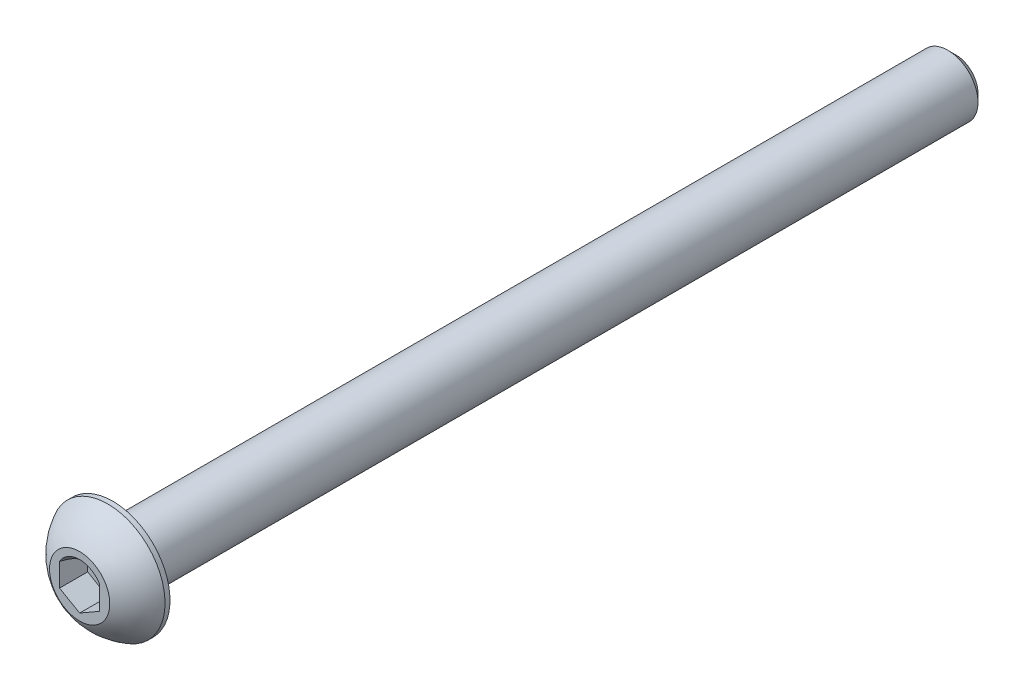
ISO-10303-21;
HEADER;
FILE_DESCRIPTION(('STEP AP214'),'2;1');
FILE_NAME('part.step','',(''),(''),'','','');
FILE_SCHEMA(('AUTOMOTIVE_DESIGN { 1 0 10303 214 1 1 1 1 }'));
ENDSEC;
DATA;
#1=APPLICATION_CONTEXT('core data for automotive mechanical design processes');
#2=APPLICATION_PROTOCOL_DEFINITION('international standard','automotive_design',2000,#1);
#3=PRODUCT_CONTEXT('',#1,'mechanical');
#4=PRODUCT('Part','Part','',(#3));
#5=PRODUCT_RELATED_PRODUCT_CATEGORY('part','',(#4));
#6=PRODUCT_DEFINITION_FORMATION('','',#4);
#7=PRODUCT_DEFINITION_CONTEXT('part definition',#1,'design');
#8=PRODUCT_DEFINITION('design','',#6,#7);
#9=PRODUCT_DEFINITION_SHAPE('','',#8);
#10=(LENGTH_UNIT() NAMED_UNIT(*) SI_UNIT(.MILLI.,.METRE.));
#11=(NAMED_UNIT(*) PLANE_ANGLE_UNIT() SI_UNIT($,.RADIAN.));
#12=(NAMED_UNIT(*) SI_UNIT($,.STERADIAN.) SOLID_ANGLE_UNIT());
#13=UNCERTAINTY_MEASURE_WITH_UNIT(LENGTH_MEASURE(1.E-05),#10,'distance_accuracy_value','');
#14=(GEOMETRIC_REPRESENTATION_CONTEXT(3) GLOBAL_UNCERTAINTY_ASSIGNED_CONTEXT((#13)) GLOBAL_UNIT_ASSIGNED_CONTEXT((#10,
#11,#12)) REPRESENTATION_CONTEXT('',''));
#15=CARTESIAN_POINT('',(0.,0.,0.));
#16=DIRECTION('',(0.,0.,1.));
#17=DIRECTION('',(1.,0.,0.));
#18=AXIS2_PLACEMENT_3D('',#15,#16,#17);
#19=CARTESIAN_POINT('',(-1.,-0.577350269189625,11.925));
#20=DIRECTION('',(-0.5,-0.866025403784439,0.));
#21=DIRECTION('',(0.866025403784439,-0.5,0.));
#22=AXIS2_PLACEMENT_3D('',#19,#20,#21);
#23=PLANE('',#22);
#24=DIRECTION('',(0.,0.,1.));
#25=VECTOR('',#24,1.);
#26=CARTESIAN_POINT('',(0.,-1.15470053837925,11.925));
#27=LINE('',#26,#25);
#28=CARTESIAN_POINT('',(-9.43135101427321E-12,-1.15470053838773,13.3250000000035));
#29=VERTEX_POINT('',#28);
#30=CARTESIAN_POINT('',(0.,-1.15470053837925,11.925));
#31=VERTEX_POINT('',#30);
#32=EDGE_CURVE('E108',#29,#31,#27,.F.);
#33=ORIENTED_EDGE('',*,*,#32,.T.);
#34=DIRECTION('',(0.866025403784439,-0.5,0.));
#35=VECTOR('',#34,1.);
#36=CARTESIAN_POINT('',(-1.,-0.577350269189625,11.925));
#37=LINE('',#36,#35);
#38=CARTESIAN_POINT('',(-1.,-0.577350269189625,11.925));
#39=VERTEX_POINT('',#38);
#40=EDGE_CURVE('E111',#39,#31,#37,.T.);
#41=ORIENTED_EDGE('',*,*,#40,.F.);
#42=DIRECTION('',(0.,0.,1.));
#43=VECTOR('',#42,1.);
#44=CARTESIAN_POINT('',(-1.,-0.577350269189625,11.925));
#45=LINE('',#44,#43);
#46=CARTESIAN_POINT('',(-1.00000000000603,-0.577350269193105,13.325000000002));
#47=VERTEX_POINT('',#46);
#48=EDGE_CURVE('E84',#39,#47,#45,.T.);
#49=ORIENTED_EDGE('',*,*,#48,.T.);
#50=DIRECTION('',(-0.866025403784439,0.5,0.));
#51=VECTOR('',#50,1.);
#52=CARTESIAN_POINT('',(-0.5,-0.866025403784437,13.325));
#53=LINE('',#52,#51);
#54=EDGE_CURVE('E113',#47,#29,#53,.F.);
#55=ORIENTED_EDGE('',*,*,#54,.T.);
#56=EDGE_LOOP('',(#33,#41,#49,#55));
#57=FACE_BOUND('',#56,.T.);
#58=ADVANCED_FACE('F47',(#57),#23,.F.);
#59=CARTESIAN_POINT('',(0.,-1.15470053837925,11.925));
#60=DIRECTION('',(0.5,-0.866025403784439,0.));
#61=DIRECTION('',(0.866025403784439,0.5,0.));
#62=AXIS2_PLACEMENT_3D('',#59,#60,#61);
#63=PLANE('',#62);
#64=DIRECTION('',(0.,0.,1.));
#65=VECTOR('',#64,1.);
#66=CARTESIAN_POINT('',(1.,-0.577350269189626,11.925));
#67=LINE('',#66,#65);
#68=CARTESIAN_POINT('',(1.00000000000263,-0.57735026920203,13.3250000000035));
#69=VERTEX_POINT('',#68);
#70=CARTESIAN_POINT('',(0.999999999999999,-0.577350269189625,11.925));
#71=VERTEX_POINT('',#70);
#72=EDGE_CURVE('E117',#69,#71,#67,.F.);
#73=ORIENTED_EDGE('',*,*,#72,.T.);
#74=DIRECTION('',(0.866025403784439,0.5,0.));
#75=VECTOR('',#74,1.);
#76=CARTESIAN_POINT('',(0.,-1.15470053837925,11.925));
#77=LINE('',#76,#75);
#78=EDGE_CURVE('E121',#31,#71,#77,.T.);
#79=ORIENTED_EDGE('',*,*,#78,.F.);
#80=ORIENTED_EDGE('',*,*,#32,.F.);
#81=DIRECTION('',(-0.866025403784439,-0.5,0.));
#82=VECTOR('',#81,1.);
#83=CARTESIAN_POINT('',(0.5,-0.866025403784437,13.325));
#84=LINE('',#83,#82);
#85=EDGE_CURVE('E339',#29,#69,#84,.F.);
#86=ORIENTED_EDGE('',*,*,#85,.T.);
#87=EDGE_LOOP('',(#73,#79,#80,#86));
#88=FACE_BOUND('',#87,.T.);
#89=ADVANCED_FACE('F122',(#88),#63,.F.);
#90=CARTESIAN_POINT('',(1.,-0.577350269189626,11.925));
#91=DIRECTION('',(1.,0.,0.));
#92=DIRECTION('',(0.,1.,0.));
#93=AXIS2_PLACEMENT_3D('',#90,#91,#92);
#94=PLANE('',#93);
#95=DIRECTION('',(0.,0.,1.));
#96=VECTOR('',#95,1.);
#97=CARTESIAN_POINT('',(1.,0.577350269189626,11.925));
#98=LINE('',#97,#96);
#99=CARTESIAN_POINT('',(1.00000000001206,0.577350269185698,13.3250000000035));
#100=VERTEX_POINT('',#99);
#101=CARTESIAN_POINT('',(1.,0.577350269189626,11.925));
#102=VERTEX_POINT('',#101);
#103=EDGE_CURVE('E294',#100,#102,#98,.F.);
#104=ORIENTED_EDGE('',*,*,#103,.T.);
#105=DIRECTION('',(0.,1.,0.));
#106=VECTOR('',#105,1.);
#107=CARTESIAN_POINT('',(0.999999999999999,-0.577350269189625,11.925));
#108=LINE('',#107,#106);
#109=EDGE_CURVE('E127',#71,#102,#108,.T.);
#110=ORIENTED_EDGE('',*,*,#109,.F.);
#111=ORIENTED_EDGE('',*,*,#72,.F.);
#112=DIRECTION('',(0.,1.,0.));
#113=VECTOR('',#112,1.);
#114=CARTESIAN_POINT('',(1.,-0.577350269189626,13.325));
#115=LINE('',#114,#113);
#116=EDGE_CURVE('E311',#100,#69,#115,.F.);
#117=ORIENTED_EDGE('',*,*,#116,.F.);
#118=EDGE_LOOP('',(#104,#110,#111,#117));
#119=FACE_BOUND('',#118,.T.);
#120=ADVANCED_FACE('F266',(#119),#94,.F.);
#121=CARTESIAN_POINT('',(1.,0.577350269189626,11.925));
#122=DIRECTION('',(0.5,0.866025403784439,0.));
#123=DIRECTION('',(-0.866025403784439,0.5,0.));
#124=AXIS2_PLACEMENT_3D('',#121,#122,#123);
#125=PLANE('',#124);
#126=CARTESIAN_POINT('',(1.00000000000525,0.577350269186594,13.324999999998));
#127=CARTESIAN_POINT('',(0.965629464440149,0.597194107147297,13.3051752996837));
#128=CARTESIAN_POINT('',(0.930684324300195,0.617369693213969,13.2865150336239));
#129=CARTESIAN_POINT('',(0.8594275968982,0.658509783961083,13.2523488768792));
#130=CARTESIAN_POINT('',(0.823109236817594,0.679478198930147,13.2368619899814));
#131=CARTESIAN_POINT('',(0.74987490220793,0.721760061730959,13.2103330403486));
#132=CARTESIAN_POINT('',(0.712977570436517,0.743062746161563,13.1992243125686));
#133=CARTESIAN_POINT('',(0.638371399377878,0.786136639105476,13.1821084869186));
#134=CARTESIAN_POINT('',(0.60066483616718,0.807906533525388,13.1760886198535));
#135=CARTESIAN_POINT('',(0.535672283803175,0.845430001128067,13.170658884781));
#136=CARTESIAN_POINT('',(0.508470695023775,0.861134845732239,13.1698565669596));
#137=CARTESIAN_POINT('',(0.4541202910969,0.892514066069985,13.1712087797907));
#138=CARTESIAN_POINT('',(0.426971488933432,0.90818843430724,13.1733639636027));
#139=CARTESIAN_POINT('',(0.34591297186365,0.95498759095759,13.1841233197716));
#140=CARTESIAN_POINT('',(0.29240676238654,0.985879415402516,13.1970225083002));
#141=CARTESIAN_POINT('',(0.198537260412465,1.04007499763594,13.2281376807148));
#142=CARTESIAN_POINT('',(0.157732128751725,1.06363385138459,13.2447169878269));
#143=CARTESIAN_POINT('',(0.0777188011184801,1.1098295676324,13.2820612850242));
#144=CARTESIAN_POINT('',(0.0385058936708872,1.13246915030298,13.3028126496726));
#145=CARTESIAN_POINT('',(-5.25105078779616E-12,1.15470053838228,13.324999999998));
#146=B_SPLINE_CURVE_WITH_KNOTS('',3,(#126,#127,#128,#129,#130,#131,#132,#133,#134,#135,#136,
#137,#138,#139,#140,#141,#142,#143,#144,#145),.UNSPECIFIED.,.F.,.F.,(4,2,2,2,2,2,2,2,2,4),(0.,
0.133182946614459,0.26714154153387,0.3989733269148,0.530473323835293,0.624596460625923,
0.718740387705453,0.907081600900384,1.05673041344434,1.20589820621255),.UNSPECIFIED.);
#147=CARTESIAN_POINT('',(9.43155724379009E-12,1.15470053838773,13.3250000000035));
#148=VERTEX_POINT('',#147);
#149=EDGE_CURVE('E214',#100,#148,#146,.T.);
#150=ORIENTED_EDGE('',*,*,#149,.T.);
#151=DIRECTION('',(0.,0.,1.));
#152=VECTOR('',#151,1.);
#153=CARTESIAN_POINT('',(0.,1.15470053837925,11.925));
#154=LINE('',#153,#152);
#155=CARTESIAN_POINT('',(0.,1.15470053837925,11.925));
#156=VERTEX_POINT('',#155);
#157=EDGE_CURVE('E293',#148,#156,#154,.F.);
#158=ORIENTED_EDGE('',*,*,#157,.T.);
#159=DIRECTION('',(-0.866025403784439,0.5,0.));
#160=VECTOR('',#159,1.);
#161=CARTESIAN_POINT('',(1.,0.577350269189626,11.925));
#162=LINE('',#161,#160);
#163=EDGE_CURVE('E138',#102,#156,#162,.T.);
#164=ORIENTED_EDGE('',*,*,#163,.F.);
#165=ORIENTED_EDGE('',*,*,#103,.F.);
#166=EDGE_LOOP('',(#150,#158,#164,#165));
#167=FACE_BOUND('',#166,.T.);
#168=ADVANCED_FACE('F282',(#167),#125,.F.);
#169=CARTESIAN_POINT('',(0.,1.15470053837925,11.925));
#170=DIRECTION('',(-0.5,0.866025403784439,0.));
#171=DIRECTION('',(-0.866025403784439,-0.5,0.));
#172=AXIS2_PLACEMENT_3D('',#169,#170,#171);
#173=PLANE('',#172);
#174=CARTESIAN_POINT('',(5.25096501497097E-12,1.15470053838228,13.324999999998));
#175=CARTESIAN_POINT('',(-0.0343705355598505,1.13485670042158,13.3051752996837));
#176=CARTESIAN_POINT('',(-0.0693156756998051,1.11468111435491,13.2865150336239));
#177=CARTESIAN_POINT('',(-0.140572403101799,1.07354102360779,13.2523488768792));
#178=CARTESIAN_POINT('',(-0.176890763182406,1.05257260863873,13.2368619899814));
#179=CARTESIAN_POINT('',(-0.250125097792069,1.01029074583792,13.2103330403486));
#180=CARTESIAN_POINT('',(-0.287022429563482,0.988988061407313,13.1992243125685));
#181=CARTESIAN_POINT('',(-0.361628600622121,0.945914168463401,13.1821084869186));
#182=CARTESIAN_POINT('',(-0.399335163832818,0.924144274043489,13.1760886198535));
#183=CARTESIAN_POINT('',(-0.464327716196823,0.88662080644081,13.1706588847809));
#184=CARTESIAN_POINT('',(-0.491529304976223,0.870915961836638,13.1698565669596));
#185=CARTESIAN_POINT('',(-0.545879708903098,0.839536741498892,13.1712087797907));
#186=CARTESIAN_POINT('',(-0.573028511066566,0.823862373261637,13.1733639636027));
#187=CARTESIAN_POINT('',(-0.654087028136348,0.777063216611287,13.1841233197716));
#188=CARTESIAN_POINT('',(-0.707593237613458,0.746171392166361,13.1970225083002));
#189=CARTESIAN_POINT('',(-0.801462739587533,0.691975809932933,13.2281376807148));
#190=CARTESIAN_POINT('',(-0.842267871248274,0.668416956184286,13.2447169878269));
#191=CARTESIAN_POINT('',(-0.922281198881519,0.622221239936474,13.2820612850242));
#192=CARTESIAN_POINT('',(-0.961494106329112,0.599581657265899,13.3028126496726));
#193=CARTESIAN_POINT('',(-1.00000000000525,0.577350269186593,13.324999999998));
#194=B_SPLINE_CURVE_WITH_KNOTS('',3,(#174,#175,#176,#177,#178,#179,#180,#181,#182,#183,#184,
#185,#186,#187,#188,#189,#190,#191,#192,#193),.UNSPECIFIED.,.F.,.F.,(4,2,2,2,2,2,2,2,2,4),(0.,
0.133182946614459,0.267141541533869,0.398973326914798,0.530473323835291,0.624596460625921,
0.718740387705451,0.907081600900382,1.05673041344434,1.20589820621255),.UNSPECIFIED.);
#195=CARTESIAN_POINT('',(-1.00000000000263,0.57735026920203,13.3250000000035));
#196=VERTEX_POINT('',#195);
#197=EDGE_CURVE('E65',#148,#196,#194,.T.);
#198=ORIENTED_EDGE('',*,*,#197,.T.);
#199=DIRECTION('',(0.,0.,1.));
#200=VECTOR('',#199,1.);
#201=CARTESIAN_POINT('',(-1.,0.577350269189626,11.925));
#202=LINE('',#201,#200);
#203=CARTESIAN_POINT('',(-0.999999999999999,0.577350269189625,11.925));
#204=VERTEX_POINT('',#203);
#205=EDGE_CURVE('E94',#196,#204,#202,.F.);
#206=ORIENTED_EDGE('',*,*,#205,.T.);
#207=DIRECTION('',(-0.866025403784438,-0.500000000000001,0.));
#208=VECTOR('',#207,1.);
#209=CARTESIAN_POINT('',(0.,1.15470053837925,11.925));
#210=LINE('',#209,#208);
#211=EDGE_CURVE('E141',#156,#204,#210,.T.);
#212=ORIENTED_EDGE('',*,*,#211,.F.);
#213=ORIENTED_EDGE('',*,*,#157,.F.);
#214=EDGE_LOOP('',(#198,#206,#212,#213));
#215=FACE_BOUND('',#214,.T.);
#216=ADVANCED_FACE('F225',(#215),#173,.F.);
#217=CARTESIAN_POINT('',(-1.,0.577350269189626,11.925));
#218=DIRECTION('',(-1.,0.,0.));
#219=DIRECTION('',(0.,0.,1.));
#220=AXIS2_PLACEMENT_3D('',#217,#218,#219);
#221=PLANE('',#220);
#222=ORIENTED_EDGE('',*,*,#48,.F.);
#223=DIRECTION('',(0.,-1.,0.));
#224=VECTOR('',#223,1.);
#225=CARTESIAN_POINT('',(-0.999999999999999,0.577350269189625,11.925));
#226=LINE('',#225,#224);
#227=EDGE_CURVE('E118',#204,#39,#226,.T.);
#228=ORIENTED_EDGE('',*,*,#227,.F.);
#229=ORIENTED_EDGE('',*,*,#205,.F.);
#230=DIRECTION('',(0.,1.,0.));
#231=VECTOR('',#230,1.);
#232=CARTESIAN_POINT('',(-1.,0.,13.325));
#233=LINE('',#232,#231);
#234=EDGE_CURVE('E167',#196,#47,#233,.F.);
#235=ORIENTED_EDGE('',*,*,#234,.T.);
#236=EDGE_LOOP('',(#222,#228,#229,#235));
#237=FACE_BOUND('',#236,.T.);
#238=ADVANCED_FACE('F235',(#237),#221,.F.);
#239=CARTESIAN_POINT('',(0.,0.,13.3249999998952));
#240=DIRECTION('',(0.,0.,1.));
#241=DIRECTION('',(0.,-1.,0.));
#242=AXIS2_PLACEMENT_3D('',#239,#240,#241);
#243=CONICAL_SURFACE('',#242,1.15470053827949,0.785398163580071);
#244=ORIENTED_EDGE('',*,*,#149,.F.);
#245=CARTESIAN_POINT('',(0.,0.,13.3250000000089));
#246=DIRECTION('',(0.,0.,1.));
#247=DIRECTION('',(0.,-1.,0.));
#248=AXIS2_PLACEMENT_3D('',#245,#246,#247);
#249=CIRCLE('',#248,1.15470053839317);
#250=EDGE_CURVE('E174',#100,#148,#249,.T.);
#251=ORIENTED_EDGE('',*,*,#250,.T.);
#252=EDGE_LOOP('',(#244,#251));
#253=FACE_BOUND('',#252,.T.);
#254=ADVANCED_FACE('F231',(#253),#243,.F.);
#255=CARTESIAN_POINT('',(0.,0.,13.3249999998952));
#256=DIRECTION('',(0.,0.,1.));
#257=DIRECTION('',(0.,-1.,0.));
#258=AXIS2_PLACEMENT_3D('',#255,#256,#257);
#259=CONICAL_SURFACE('',#258,1.15470053827949,0.785398163580071);
#260=ORIENTED_EDGE('',*,*,#197,.F.);
#261=CARTESIAN_POINT('',(0.,0.,13.3250000000089));
#262=DIRECTION('',(0.,0.,1.));
#263=DIRECTION('',(0.,-1.,0.));
#264=AXIS2_PLACEMENT_3D('',#261,#262,#263);
#265=CIRCLE('',#264,1.15470053839317);
#266=EDGE_CURVE('E168',#148,#196,#265,.T.);
#267=ORIENTED_EDGE('',*,*,#266,.T.);
#268=EDGE_LOOP('',(#260,#267));
#269=FACE_BOUND('',#268,.T.);
#270=ADVANCED_FACE('F228',(#269),#259,.F.);
#271=CARTESIAN_POINT('',(0.,0.,13.325));
#272=DIRECTION('',(0.,0.,-1.));
#273=DIRECTION('',(-1.,0.,0.));
#274=AXIS2_PLACEMENT_3D('',#271,#272,#273);
#275=PLANE('',#274);
#276=ORIENTED_EDGE('',*,*,#266,.F.);
#277=ORIENTED_EDGE('',*,*,#250,.F.);
#278=ORIENTED_EDGE('',*,*,#116,.T.);
#279=ORIENTED_EDGE('',*,*,#85,.F.);
#280=ORIENTED_EDGE('',*,*,#54,.F.);
#281=ORIENTED_EDGE('',*,*,#234,.F.);
#282=EDGE_LOOP('',(#276,#277,#278,#279,#280,#281));
#283=FACE_BOUND('',#282,.T.);
#284=CARTESIAN_POINT('',(0.,-1.50000000000006,13.325));
#285=CARTESIAN_POINT('',(0.0842667293195965,-1.49999421601265,13.3249999999999));
#286=CARTESIAN_POINT('',(0.168621384439771,-1.49286560655355,13.3249999999999));
#287=CARTESIAN_POINT('',(0.293275094816346,-1.47165849322199,13.3250000000001));
#288=CARTESIAN_POINT('',(0.334546556048753,-1.46282545080437,13.3250000000002));
#289=CARTESIAN_POINT('',(0.416239998691033,-1.44170885752278,13.3249999999998));
#290=CARTESIAN_POINT('',(0.45666119773802,-1.42942226639945,13.3249999999994));
#291=CARTESIAN_POINT('',(0.576048060305988,-1.38753930782197,13.324999999999));
#292=CARTESIAN_POINT('',(0.653300598348412,-1.35289174076138,13.325));
#293=CARTESIAN_POINT('',(0.800884189888796,-1.27110265741329,13.325));
#294=CARTESIAN_POINT('',(0.871215109038946,-1.22396089868055,13.3249999999992));
#295=CARTESIAN_POINT('',(0.969995429911115,-1.14494307282518,13.3249999999995));
#296=CARTESIAN_POINT('',(1.00182191344125,-1.11719823757577,13.3249999999999));
#297=CARTESIAN_POINT('',(1.06299701707975,-1.05915715273579,13.3250000000001));
#298=CARTESIAN_POINT('',(1.09234798919224,-1.02886338086035,13.3250000000001));
#299=CARTESIAN_POINT('',(1.1764278444788,-0.934404027890233,13.3249999999998));
#300=CARTESIAN_POINT('',(1.2272082584294,-0.866640697977093,13.3249999999996));
#301=CARTESIAN_POINT('',(1.31664288317194,-0.723586131447797,13.3249999999997));
#302=CARTESIAN_POINT('',(1.35529731978824,-0.648295035057093,13.325));
#303=CARTESIAN_POINT('',(1.4194246434321,-0.492282900395114,13.325));
#304=CARTESIAN_POINT('',(1.44489755696506,-0.411561873042711,13.3249999999998));
#305=CARTESIAN_POINT('',(1.48192797672054,-0.246991310365275,13.3249999999998));
#306=CARTESIAN_POINT('',(1.49348545641524,-0.163141769076483,13.325));
#307=CARTESIAN_POINT('',(1.50235975201479,0.00530803653054311,13.325));
#308=CARTESIAN_POINT('',(1.49967659357985,0.0899082994957767,13.3249999999999));
#309=CARTESIAN_POINT('',(1.48014505236756,0.257457441973803,13.3249999999999));
#310=CARTESIAN_POINT('',(1.46329666430451,0.340406320870376,13.325));
#311=CARTESIAN_POINT('',(1.41591311717858,0.502298273998222,13.325));
#312=CARTESIAN_POINT('',(1.38537794366784,0.581241344000837,13.3249999999999));
#313=CARTESIAN_POINT('',(1.31148758236783,0.732880543224053,13.3249999999999));
#314=CARTESIAN_POINT('',(1.26813239875047,0.805576674477531,13.325));
#315=CARTESIAN_POINT('',(1.16983277529939,0.942658381263173,13.325));
#316=CARTESIAN_POINT('',(1.11488834015663,1.00704396015916,13.3249999999999));
#317=CARTESIAN_POINT('',(0.994969901129118,1.1256768846029,13.3249999999998));
#318=CARTESIAN_POINT('',(0.92999589586991,1.1799242287613,13.325));
#319=CARTESIAN_POINT('',(0.791862734862755,1.27674075771368,13.325));
#320=CARTESIAN_POINT('',(0.718703578045146,1.31930994098153,13.325));
#321=CARTESIAN_POINT('',(0.566276897455737,1.39156172281634,13.325));
#322=CARTESIAN_POINT('',(0.487009373945477,1.42124432193506,13.3250000000002));
#323=CARTESIAN_POINT('',(0.324616132997596,1.46688033543,13.3249999999998));
#324=CARTESIAN_POINT('',(0.241490415733792,1.48283375042473,13.3249999999993));
#325=CARTESIAN_POINT('',(0.0737404785481155,1.50055852738668,13.3249999999994));
#326=CARTESIAN_POINT('',(-0.0108837413737574,1.50232988935389,13.325));
#327=CARTESIAN_POINT('',(-0.179228455000104,1.49164027629416,13.325));
#328=CARTESIAN_POINT('',(-0.262948948663863,1.47917930062603,13.3249999999993));
#329=CARTESIAN_POINT('',(-0.42710963058989,1.44037874079312,13.3249999999993));
#330=CARTESIAN_POINT('',(-0.507549818711706,1.4140391560341,13.325));
#331=CARTESIAN_POINT('',(-0.662866415059858,1.34822908577817,13.325));
#332=CARTESIAN_POINT('',(-0.737742824013284,1.30875860199725,13.3249999999994));
#333=CARTESIAN_POINT('',(-0.879806342217085,1.217807188724,13.3249999999993));
#334=CARTESIAN_POINT('',(-0.946993452521207,1.16632626087761,13.3249999999999));
#335=CARTESIAN_POINT('',(-1.07177117004616,1.05281532961885,13.3250000000001));
#336=CARTESIAN_POINT('',(-1.12936177338264,0.990785321936593,13.3249999999996));
#337=CARTESIAN_POINT('',(-1.23331162046988,0.857937056894689,13.3249999999995));
#338=CARTESIAN_POINT('',(-1.27967086056571,0.787118796675171,13.3249999999999));
#339=CARTESIAN_POINT('',(-1.35984195442575,0.638704509171828,13.3250000000001));
#340=CARTESIAN_POINT('',(-1.39365382143503,0.561108489042748,13.3249999999998));
#341=CARTESIAN_POINT('',(-1.4477702458029,0.401341130483827,13.3249999999998));
#342=CARTESIAN_POINT('',(-1.46807480820169,0.319169793761262,13.325));
#343=CARTESIAN_POINT('',(-1.49460089309083,0.152585109735703,13.325));
#344=CARTESIAN_POINT('',(-1.50082239020483,0.0681717583930898,13.3249999999999));
#345=CARTESIAN_POINT('',(-1.4990033788995,-0.100503708955,13.3249999999999));
#346=CARTESIAN_POINT('',(-1.49096289766858,-0.184765825248478,13.325));
#347=CARTESIAN_POINT('',(-1.46085671497386,-0.350734851163048,13.325));
#348=CARTESIAN_POINT('',(-1.43879098530803,-0.43244175564576,13.3249999999999));
#349=CARTESIAN_POINT('',(-1.38122833674733,-0.59102833325679,13.3249999999999));
#350=CARTESIAN_POINT('',(-1.34573116770904,-0.667907916451315,13.325));
#351=CARTESIAN_POINT('',(-1.28324910301173,-0.777853280244819,13.325));
#352=CARTESIAN_POINT('',(-1.26087738060498,-0.813612170257545,13.325));
#353=CARTESIAN_POINT('',(-1.21318320370238,-0.883156590049163,13.325));
#354=CARTESIAN_POINT('',(-1.18785793132117,-0.916940188373274,13.3249999999999));
#355=CARTESIAN_POINT('',(-1.10777288863215,-1.01485726825239,13.3249999999998));
#356=CARTESIAN_POINT('',(-1.04884722200881,-1.07565652332954,13.325));
#357=CARTESIAN_POINT('',(-0.921615765514945,-1.18648308659542,13.325));
#358=CARTESIAN_POINT('',(-0.853310157694277,-1.23651060379821,13.3249999999997));
#359=CARTESIAN_POINT('',(-0.745312778061582,-1.3024194132667,13.3249999999998));
#360=CARTESIAN_POINT('',(-0.708351954830637,-1.32288233583227,13.3249999999999));
#361=CARTESIAN_POINT('',(-0.632875662489205,-1.36060578181722,13.3250000000001));
#362=CARTESIAN_POINT('',(-0.594361593850644,-1.37786911485351,13.3250000000001));
#363=CARTESIAN_POINT('',(-0.476892614720292,-1.42465937140999,13.3249999999998));
#364=CARTESIAN_POINT('',(-0.395890519443884,-1.44925988917075,13.3249999999994));
#365=CARTESIAN_POINT('',(-0.26199108710374,-1.4778851136738,13.3249999999996));
#366=CARTESIAN_POINT('',(-0.209948646001106,-1.48616651371939,13.3249999999999));
#367=CARTESIAN_POINT('',(-0.105282248279755,-1.49722576408981,13.3250000000001));
#368=CARTESIAN_POINT('',(-0.0526582916610363,-1.50000361441465,13.3250000000001));
#369=CARTESIAN_POINT('',(0.,-1.50000000000006,13.325));
#370=B_SPLINE_CURVE_WITH_KNOTS('',3,(#284,#285,#286,#287,#288,#289,#290,#291,#292,#293,#294,
#295,#296,#297,#298,#299,#300,#301,#302,#303,#304,#305,#306,#307,#308,#309,#310,#311,#312,#313,
#314,#315,#316,#317,#318,#319,#320,#321,#322,#323,#324,#325,#326,#327,#328,#329,#330,#331,#332,
#333,#334,#335,#336,#337,#338,#339,#340,#341,#342,#343,#344,#345,#346,#347,#348,#349,#350,#351,
#352,#353,#354,#355,#356,#357,#358,#359,#360,#361,#362,#363,#364,#365,#366,#367,#368,#369),
.UNSPECIFIED.,.T.,.F.,(4,2,2,2,2,2,2,2,2,2,2,2,2,2,2,2,2,2,2,2,2,2,2,2,2,2,2,2,2,2,2,2,2,2,2,2,
2,2,2,2,2,2,4),(0.,0.252574811435873,0.379071097768531,0.505679093117216,0.758403538319248,
1.01113288790602,1.13766709951794,1.2640797028626,1.51681156130275,1.76953871279045,
2.02226535609249,2.27499248118175,2.52771915088207,2.78044591488645,3.03317294567157,
3.28589989421401,3.53862674046106,3.79135362134219,4.04408053525058,4.29680743833806,
4.54953433003986,4.80226122174172,5.05498812482923,5.30771503873758,5.56044191961873,
5.81316876586596,6.06589571440855,6.31862274519381,6.57134950919835,6.8240761788987,
7.07680330398797,7.32952994728988,7.58225709877748,7.8349889572175,7.96140156056203,
8.08793577217388,8.34066512176096,8.59338956696319,8.7199975623121,8.84649384864503,
9.09906866008096,9.25690269724134,9.41473673440182),.UNSPECIFIED.);
#371=CARTESIAN_POINT('',(0.,-1.50000000000006,13.325));
#372=VERTEX_POINT('',#371);
#373=EDGE_CURVE('E159',#372,#372,#370,.F.);
#374=ORIENTED_EDGE('',*,*,#373,.F.);
#375=EDGE_LOOP('',(#374));
#376=FACE_BOUND('',#375,.T.);
#377=ADVANCED_FACE('F153',(#283,#376),#275,.F.);
#378=CARTESIAN_POINT('',(0.,0.,10.5301671122995));
#379=DIRECTION('',(0.,1.,0.));
#380=DIRECTION('',(0.,0.,-1.));
#381=AXIS2_PLACEMENT_3D('',#378,#379,#380);
#382=SPHERICAL_SURFACE('',#381,3.17192226735973);
#383=ORIENTED_EDGE('',*,*,#373,.T.);
#384=EDGE_LOOP('',(#383));
#385=FACE_BOUND('',#384,.T.);
#386=CARTESIAN_POINT('',(0.,0.,11.9225));
#387=DIRECTION('',(0.,0.,-1.));
#388=DIRECTION('',(-1.,0.,0.));
#389=AXIS2_PLACEMENT_3D('',#386,#387,#388);
#390=CIRCLE('',#389,2.85);
#391=CARTESIAN_POINT('',(-2.85,0.,11.9225));
#392=VERTEX_POINT('',#391);
#393=EDGE_CURVE('E133',#392,#392,#390,.T.);
#394=ORIENTED_EDGE('',*,*,#393,.F.);
#395=EDGE_LOOP('',(#394));
#396=FACE_BOUND('',#395,.T.);
#397=ADVANCED_FACE('F148',(#385,#396),#382,.T.);
#398=CARTESIAN_POINT('',(0.,0.,11.925));
#399=DIRECTION('',(0.,0.,1.));
#400=DIRECTION('',(1.,0.,0.));
#401=AXIS2_PLACEMENT_3D('',#398,#399,#400);
#402=PLANE('',#401);
#403=ORIENTED_EDGE('',*,*,#40,.T.);
#404=ORIENTED_EDGE('',*,*,#78,.T.);
#405=ORIENTED_EDGE('',*,*,#109,.T.);
#406=ORIENTED_EDGE('',*,*,#163,.T.);
#407=ORIENTED_EDGE('',*,*,#211,.T.);
#408=ORIENTED_EDGE('',*,*,#227,.T.);
#409=EDGE_LOOP('',(#403,#404,#405,#406,#407,#408));
#410=FACE_BOUND('',#409,.T.);
#411=ADVANCED_FACE('F129',(#410),#402,.T.);
#412=CARTESIAN_POINT('',(0.,0.,11.675));
#413=DIRECTION('',(0.,0.,1.));
#414=DIRECTION('',(1.,0.,0.));
#415=AXIS2_PLACEMENT_3D('',#412,#413,#414);
#416=CYLINDRICAL_SURFACE('',#415,2.85);
#417=CARTESIAN_POINT('',(0.,0.,11.675));
#418=DIRECTION('',(0.,0.,-1.));
#419=DIRECTION('',(-1.,0.,0.));
#420=AXIS2_PLACEMENT_3D('',#417,#418,#419);
#421=CIRCLE('',#420,2.85);
#422=CARTESIAN_POINT('',(-2.85,0.,11.675));
#423=VERTEX_POINT('',#422);
#424=EDGE_CURVE('E130',#423,#423,#421,.T.);
#425=ORIENTED_EDGE('',*,*,#424,.F.);
#426=EDGE_LOOP('',(#425));
#427=FACE_BOUND('',#426,.T.);
#428=ORIENTED_EDGE('',*,*,#393,.T.);
#429=EDGE_LOOP('',(#428));
#430=FACE_BOUND('',#429,.T.);
#431=ADVANCED_FACE('F365',(#427,#430),#416,.T.);
#432=CARTESIAN_POINT('',(0.,0.,11.675));
#433=DIRECTION('',(0.,0.,-1.));
#434=DIRECTION('',(-1.,0.,0.));
#435=AXIS2_PLACEMENT_3D('',#432,#433,#434);
#436=PLANE('',#435);
#437=CARTESIAN_POINT('',(0.,0.,11.675));
#438=DIRECTION('',(0.,0.,-1.));
#439=DIRECTION('',(-1.,0.,0.));
#440=AXIS2_PLACEMENT_3D('',#437,#438,#439);
#441=CIRCLE('',#440,1.49999999999999);
#442=CARTESIAN_POINT('',(1.49999999999999,0.,11.675));
#443=VERTEX_POINT('',#442);
#444=EDGE_CURVE('E338',#443,#443,#441,.T.);
#445=ORIENTED_EDGE('',*,*,#444,.F.);
#446=EDGE_LOOP('',(#445));
#447=FACE_BOUND('',#446,.T.);
#448=ORIENTED_EDGE('',*,*,#424,.T.);
#449=EDGE_LOOP('',(#448));
#450=FACE_BOUND('',#449,.T.);
#451=ADVANCED_FACE('F360',(#447,#450),#436,.T.);
#452=CARTESIAN_POINT('',(0.,0.,-30.325));
#453=DIRECTION('',(0.,0.,1.));
#454=DIRECTION('',(1.,0.,0.));
#455=AXIS2_PLACEMENT_3D('',#452,#453,#454);
#456=CYLINDRICAL_SURFACE('',#455,1.49999999999999);
#457=CARTESIAN_POINT('',(0.,0.,-29.9249999999712));
#458=DIRECTION('',(0.,0.,-1.));
#459=DIRECTION('',(-1.,0.,0.));
#460=AXIS2_PLACEMENT_3D('',#457,#458,#459);
#461=CIRCLE('',#460,1.49999999999999);
#462=CARTESIAN_POINT('',(1.49999999999999,0.,-29.9249999999712));
#463=VERTEX_POINT('',#462);
#464=EDGE_CURVE('E13',#463,#463,#461,.F.);
#465=CARTESIAN_POINT('',(1.49999999999999,0.,-29.9249999999712));
#466=CARTESIAN_POINT('',(1.49999999999999,0.,-29.4916666666382));
#467=CARTESIAN_POINT('',(1.49999999999999,0.,-29.0583333333051));
#468=CARTESIAN_POINT('',(1.49999999999999,0.,-28.1916666666391));
#469=CARTESIAN_POINT('',(1.49999999999999,0.,-27.758333333306));
#470=CARTESIAN_POINT('',(1.49999999999999,0.,-26.89166666664));
#471=CARTESIAN_POINT('',(1.49999999999999,0.,-26.4583333333069));
#472=CARTESIAN_POINT('',(1.49999999999999,0.,-25.5916666666409));
#473=CARTESIAN_POINT('',(1.49999999999999,0.,-25.1583333333078));
#474=CARTESIAN_POINT('',(1.49999999999999,0.,-24.2916666666418));
#475=CARTESIAN_POINT('',(1.49999999999999,0.,-23.8583333333087));
#476=CARTESIAN_POINT('',(1.49999999999999,0.,-22.9916666666427));
#477=CARTESIAN_POINT('',(1.49999999999999,0.,-22.5583333333096));
#478=CARTESIAN_POINT('',(1.49999999999999,0.,-21.6916666666436));
#479=CARTESIAN_POINT('',(1.49999999999999,0.,-21.2583333333105));
#480=CARTESIAN_POINT('',(1.49999999999999,0.,-20.3916666666445));
#481=CARTESIAN_POINT('',(1.49999999999999,0.,-19.9583333333114));
#482=CARTESIAN_POINT('',(1.49999999999999,0.,-19.0916666666454));
#483=CARTESIAN_POINT('',(1.49999999999999,0.,-18.6583333333123));
#484=CARTESIAN_POINT('',(1.49999999999999,0.,-17.7916666666463));
#485=CARTESIAN_POINT('',(1.49999999999999,0.,-17.3583333333132));
#486=CARTESIAN_POINT('',(1.49999999999999,0.,-16.4916666666472));
#487=CARTESIAN_POINT('',(1.49999999999999,0.,-16.0583333333141));
#488=CARTESIAN_POINT('',(1.49999999999999,0.,-15.1916666666481));
#489=CARTESIAN_POINT('',(1.49999999999999,0.,-14.758333333315));
#490=CARTESIAN_POINT('',(1.49999999999999,0.,-13.891666666649));
#491=CARTESIAN_POINT('',(1.49999999999999,0.,-13.4583333333159));
#492=CARTESIAN_POINT('',(1.49999999999999,0.,-12.5916666666499));
#493=CARTESIAN_POINT('',(1.49999999999999,0.,-12.1583333333168));
#494=CARTESIAN_POINT('',(1.49999999999999,0.,-11.2916666666508));
#495=CARTESIAN_POINT('',(1.49999999999999,0.,-10.8583333333177));
#496=CARTESIAN_POINT('',(1.49999999999999,0.,-9.99166666665166));
#497=CARTESIAN_POINT('',(1.49999999999999,0.,-9.55833333331863));
#498=CARTESIAN_POINT('',(1.49999999999999,0.,-8.69166666665256));
#499=CARTESIAN_POINT('',(1.49999999999999,0.,-8.25833333331953));
#500=CARTESIAN_POINT('',(1.49999999999999,0.,-7.39166666665346));
#501=CARTESIAN_POINT('',(1.49999999999999,0.,-6.95833333332043));
#502=CARTESIAN_POINT('',(1.49999999999999,0.,-6.09166666665436));
#503=CARTESIAN_POINT('',(1.49999999999999,0.,-5.65833333332133));
#504=CARTESIAN_POINT('',(1.49999999999999,0.,-4.79166666665526));
#505=CARTESIAN_POINT('',(1.49999999999999,0.,-4.35833333332223));
#506=CARTESIAN_POINT('',(1.49999999999999,0.,-3.49166666665616));
#507=CARTESIAN_POINT('',(1.49999999999999,0.,-3.05833333332313));
#508=CARTESIAN_POINT('',(1.49999999999999,0.,-2.19166666665706));
#509=CARTESIAN_POINT('',(1.49999999999999,0.,-1.75833333332403));
#510=CARTESIAN_POINT('',(1.49999999999999,0.,-0.89166666665796));
#511=CARTESIAN_POINT('',(1.49999999999999,0.,-0.458333333324926));
#512=CARTESIAN_POINT('',(1.49999999999999,0.,0.40833333334114));
#513=CARTESIAN_POINT('',(1.49999999999999,0.,0.841666666674172));
#514=CARTESIAN_POINT('',(1.49999999999999,0.,1.70833333334024));
#515=CARTESIAN_POINT('',(1.49999999999999,0.,2.14166666667327));
#516=CARTESIAN_POINT('',(1.49999999999999,0.,3.00833333333933));
#517=CARTESIAN_POINT('',(1.49999999999999,0.,3.44166666667236));
#518=CARTESIAN_POINT('',(1.49999999999999,0.,4.30833333333843));
#519=CARTESIAN_POINT('',(1.49999999999999,0.,4.74166666667147));
#520=CARTESIAN_POINT('',(1.49999999999999,0.,5.60833333333753));
#521=CARTESIAN_POINT('',(1.49999999999999,0.,6.04166666667057));
#522=CARTESIAN_POINT('',(1.49999999999999,0.,6.90833333333663));
#523=CARTESIAN_POINT('',(1.49999999999999,0.,7.34166666666967));
#524=CARTESIAN_POINT('',(1.49999999999999,0.,8.20833333333573));
#525=CARTESIAN_POINT('',(1.49999999999999,0.,8.64166666666877));
#526=CARTESIAN_POINT('',(1.49999999999999,0.,9.50833333333483));
#527=CARTESIAN_POINT('',(1.49999999999999,0.,9.94166666666787));
#528=CARTESIAN_POINT('',(1.49999999999999,0.,10.8083333333339));
#529=CARTESIAN_POINT('',(1.49999999999999,0.,11.241666666667));
#530=CARTESIAN_POINT('',(1.49999999999999,0.,11.675));
#531=B_SPLINE_CURVE_WITH_KNOTS('',3,(#465,#466,#467,#468,#469,#470,#471,#472,#473,#474,#475,
#476,#477,#478,#479,#480,#481,#482,#483,#484,#485,#486,#487,#488,#489,#490,#491,#492,#493,#494,
#495,#496,#497,#498,#499,#500,#501,#502,#503,#504,#505,#506,#507,#508,#509,#510,#511,#512,#513,
#514,#515,#516,#517,#518,#519,#520,#521,#522,#523,#524,#525,#526,#527,#528,#529,#530),
.UNSPECIFIED.,.F.,.F.,(4,2,2,2,2,2,2,2,2,2,2,2,2,2,2,2,2,2,2,2,2,2,2,2,2,2,2,2,2,2,2,2,4),(0.,
1.2999999999991,2.5999999999982,3.8999999999973,5.1999999999964,6.4999999999955,7.7999999999946,
9.0999999999937,10.3999999999928,11.6999999999919,12.999999999991,14.2999999999901,
15.5999999999892,16.8999999999883,18.1999999999874,19.4999999999865,20.7999999999856,
22.0999999999847,23.3999999999838,24.6999999999829,25.999999999982,27.2999999999811,
28.5999999999802,29.8999999999793,31.1999999999784,32.4999999999775,33.7999999999766,
35.0999999999757,36.3999999999748,37.6999999999739,38.999999999973,40.2999999999721,
41.5999999999712),.UNSPECIFIED.);
#532=EDGE_CURVE('BSEAM355',#463,#443,#531,.T.);
#533=ORIENTED_EDGE('',*,*,#464,.T.);
#534=ORIENTED_EDGE('',*,*,#444,.T.);
#535=ORIENTED_EDGE('',*,*,#532,.T.);
#536=ORIENTED_EDGE('',*,*,#532,.F.);
#537=EDGE_LOOP('',(#533,#535,#534,#536));
#538=FACE_BOUND('',#537,.T.);
#539=ADVANCED_FACE('F355',(#538),#456,.T.);
#540=CARTESIAN_POINT('',(0.,0.,-30.325));
#541=DIRECTION('',(0.,0.,-1.));
#542=DIRECTION('',(-1.,0.,0.));
#543=AXIS2_PLACEMENT_3D('',#540,#541,#542);
#544=PLANE('',#543);
#545=CARTESIAN_POINT('',(0.,0.,-30.325));
#546=DIRECTION('',(0.,0.,-1.));
#547=DIRECTION('',(-1.,0.,0.));
#548=AXIS2_PLACEMENT_3D('',#545,#546,#547);
#549=CIRCLE('',#548,1.09999999997119);
#550=CARTESIAN_POINT('',(-1.09999999997119,0.,-30.325));
#551=VERTEX_POINT('',#550);
#552=EDGE_CURVE('E57',#551,#551,#549,.T.);
#553=ORIENTED_EDGE('',*,*,#552,.T.);
#554=EDGE_LOOP('',(#553));
#555=FACE_BOUND('',#554,.T.);
#556=ADVANCED_FACE('F348',(#555),#544,.T.);
#557=CARTESIAN_POINT('',(0.,0.,-30.325));
#558=DIRECTION('',(0.,0.,1.));
#559=DIRECTION('',(1.,0.,0.));
#560=AXIS2_PLACEMENT_3D('',#557,#558,#559);
#561=CONICAL_SURFACE('',#560,1.09999999997119,0.785398163397434);
#562=ORIENTED_EDGE('',*,*,#464,.F.);
#563=EDGE_LOOP('',(#562));
#564=FACE_BOUND('',#563,.T.);
#565=ORIENTED_EDGE('',*,*,#552,.F.);
#566=EDGE_LOOP('',(#565));
#567=FACE_BOUND('',#566,.T.);
#568=ADVANCED_FACE('F50',(#564,#567),#561,.T.);
#569=CLOSED_SHELL('',(#58,#89,#120,#168,#216,#238,#254,#270,#377,#397,#411,#431,#451,#539,#556,#568));
#570=MANIFOLD_SOLID_BREP('B2',#569);
#571=ADVANCED_BREP_SHAPE_REPRESENTATION('',(#18,#570),#14);
#572=SHAPE_DEFINITION_REPRESENTATION(#9,#571);
ENDSEC;
END-ISO-10303-21;
